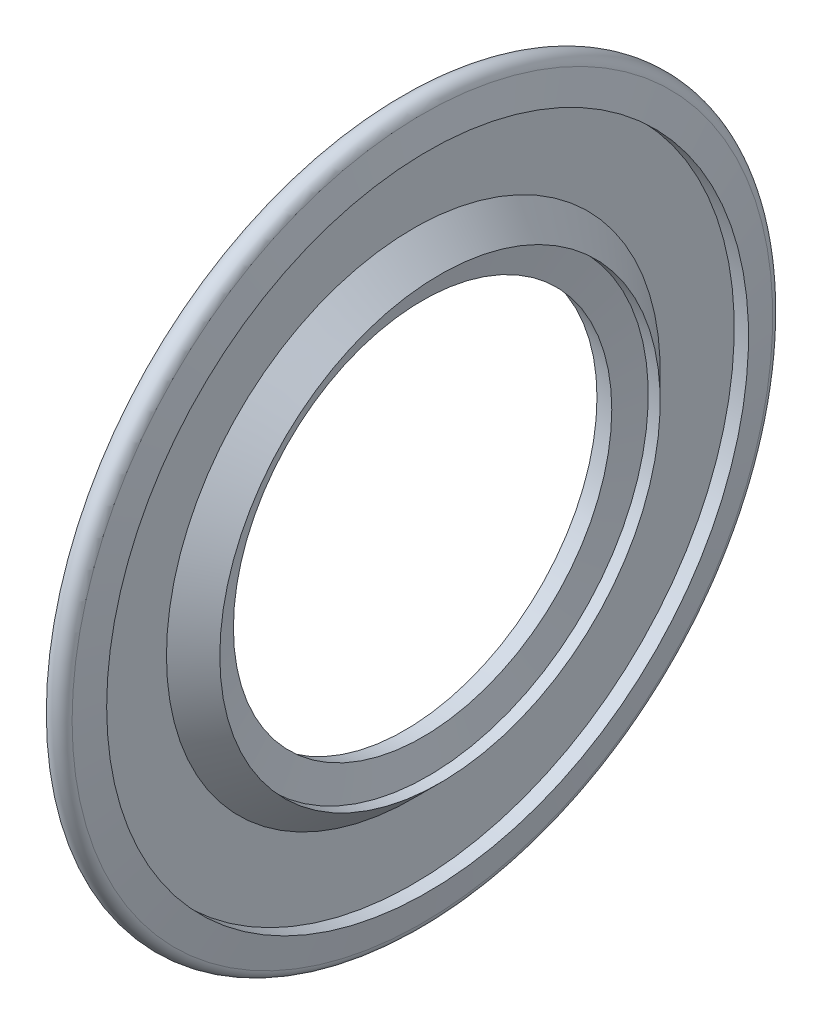
ISO-10303-21;
HEADER;
FILE_DESCRIPTION(('STEP AP214'),'2;1');
FILE_NAME('part.step','',(''),(''),'','','');
FILE_SCHEMA(('AUTOMOTIVE_DESIGN { 1 0 10303 214 1 1 1 1 }'));
ENDSEC;
DATA;
#1=APPLICATION_CONTEXT('core data for automotive mechanical design processes');
#2=APPLICATION_PROTOCOL_DEFINITION('international standard','automotive_design',2000,#1);
#3=PRODUCT_CONTEXT('',#1,'mechanical');
#4=PRODUCT('Part','Part','',(#3));
#5=PRODUCT_RELATED_PRODUCT_CATEGORY('part','',(#4));
#6=PRODUCT_DEFINITION_FORMATION('','',#4);
#7=PRODUCT_DEFINITION_CONTEXT('part definition',#1,'design');
#8=PRODUCT_DEFINITION('design','',#6,#7);
#9=PRODUCT_DEFINITION_SHAPE('','',#8);
#10=(LENGTH_UNIT() NAMED_UNIT(*) SI_UNIT(.MILLI.,.METRE.));
#11=(NAMED_UNIT(*) PLANE_ANGLE_UNIT() SI_UNIT($,.RADIAN.));
#12=(NAMED_UNIT(*) SI_UNIT($,.STERADIAN.) SOLID_ANGLE_UNIT());
#13=UNCERTAINTY_MEASURE_WITH_UNIT(LENGTH_MEASURE(1.E-05),#10,'distance_accuracy_value','');
#14=(GEOMETRIC_REPRESENTATION_CONTEXT(3) GLOBAL_UNCERTAINTY_ASSIGNED_CONTEXT((#13)) GLOBAL_UNIT_ASSIGNED_CONTEXT((#10,
#11,#12)) REPRESENTATION_CONTEXT('',''));
#15=CARTESIAN_POINT('',(0.,0.,0.));
#16=DIRECTION('',(0.,0.,1.));
#17=DIRECTION('',(1.,0.,0.));
#18=AXIS2_PLACEMENT_3D('',#15,#16,#17);
#19=CARTESIAN_POINT('',(0.304,6.075,0.));
#20=DIRECTION('',(1.,0.,0.));
#21=DIRECTION('',(0.,0.,-1.));
#22=AXIS2_PLACEMENT_3D('',#19,#20,#21);
#23=PLANE('',#22);
#24=CARTESIAN_POINT('',(0.304,0.,0.));
#25=DIRECTION('',(-1.,0.,0.));
#26=DIRECTION('',(0.,0.,1.));
#27=AXIS2_PLACEMENT_3D('',#24,#25,#26);
#28=CIRCLE('',#27,5.30689076557798);
#29=CARTESIAN_POINT('',(0.304,0.,5.30689076557798));
#30=VERTEX_POINT('',#29);
#31=EDGE_CURVE('E10',#30,#30,#28,.T.);
#32=ORIENTED_EDGE('',*,*,#31,.F.);
#33=EDGE_LOOP('',(#32));
#34=FACE_BOUND('',#33,.T.);
#35=CARTESIAN_POINT('',(0.304,0.,0.));
#36=DIRECTION('',(-1.,0.,0.));
#37=DIRECTION('',(0.,0.,1.));
#38=AXIS2_PLACEMENT_3D('',#35,#36,#37);
#39=CIRCLE('',#38,6.075);
#40=CARTESIAN_POINT('',(0.304,0.,6.075));
#41=VERTEX_POINT('',#40);
#42=EDGE_CURVE('E76',#41,#41,#39,.T.);
#43=ORIENTED_EDGE('',*,*,#42,.T.);
#44=EDGE_LOOP('',(#43));
#45=FACE_BOUND('',#44,.T.);
#46=ADVANCED_FACE('F14',(#34,#45),#23,.F.);
#47=CARTESIAN_POINT('',(0.304,0.,0.));
#48=DIRECTION('',(-1.,0.,0.));
#49=DIRECTION('',(0.,0.,1.));
#50=AXIS2_PLACEMENT_3D('',#47,#48,#49);
#51=CONICAL_SURFACE('',#50,5.30689076557798,0.174532925199432);
#52=CARTESIAN_POINT('',(0.8,0.,0.));
#53=DIRECTION('',(-1.,0.,0.));
#54=DIRECTION('',(0.,0.,1.));
#55=AXIS2_PLACEMENT_3D('',#52,#53,#54);
#56=CIRCLE('',#55,5.21943258314658);
#57=CARTESIAN_POINT('',(0.8,0.,5.21943258314658));
#58=VERTEX_POINT('',#57);
#59=EDGE_CURVE('E21',#58,#58,#56,.T.);
#60=ORIENTED_EDGE('',*,*,#59,.F.);
#61=EDGE_LOOP('',(#60));
#62=FACE_BOUND('',#61,.T.);
#63=ORIENTED_EDGE('',*,*,#31,.T.);
#64=EDGE_LOOP('',(#63));
#65=FACE_BOUND('',#64,.T.);
#66=ADVANCED_FACE('F144',(#62,#65),#51,.F.);
#67=CARTESIAN_POINT('',(0.8,0.,0.));
#68=DIRECTION('',(1.,0.,0.));
#69=DIRECTION('',(0.,0.,-1.));
#70=AXIS2_PLACEMENT_3D('',#67,#68,#69);
#71=CONICAL_SURFACE('',#70,5.21943258314658,1.39626340159546);
#72=CARTESIAN_POINT('',(0.950859619406303,0.,0.));
#73=DIRECTION('',(-1.,0.,0.));
#74=DIRECTION('',(0.,0.,1.));
#75=AXIS2_PLACEMENT_3D('',#72,#73,#74);
#76=CIRCLE('',#75,6.075);
#77=CARTESIAN_POINT('',(0.950859619406303,0.,6.075));
#78=VERTEX_POINT('',#77);
#79=EDGE_CURVE('E30',#78,#78,#76,.T.);
#80=ORIENTED_EDGE('',*,*,#79,.F.);
#81=EDGE_LOOP('',(#80));
#82=FACE_BOUND('',#81,.T.);
#83=ORIENTED_EDGE('',*,*,#59,.T.);
#84=EDGE_LOOP('',(#83));
#85=FACE_BOUND('',#84,.T.);
#86=ADVANCED_FACE('F139',(#82,#85),#71,.F.);
#87=CARTESIAN_POINT('',(0.16,0.,0.));
#88=DIRECTION('',(-1.,0.,0.));
#89=DIRECTION('',(0.,0.,1.));
#90=AXIS2_PLACEMENT_3D('',#87,#88,#89);
#91=CYLINDRICAL_SURFACE('',#90,6.075);
#92=CARTESIAN_POINT('',(1.28,0.,0.));
#93=DIRECTION('',(-1.,0.,0.));
#94=DIRECTION('',(0.,0.,1.));
#95=AXIS2_PLACEMENT_3D('',#92,#93,#94);
#96=CIRCLE('',#95,6.075);
#97=CARTESIAN_POINT('',(1.28,0.,6.075));
#98=VERTEX_POINT('',#97);
#99=EDGE_CURVE('E38',#98,#98,#96,.T.);
#100=ORIENTED_EDGE('',*,*,#99,.F.);
#101=EDGE_LOOP('',(#100));
#102=FACE_BOUND('',#101,.T.);
#103=ORIENTED_EDGE('',*,*,#79,.T.);
#104=EDGE_LOOP('',(#103));
#105=FACE_BOUND('',#104,.T.);
#106=ADVANCED_FACE('F133',(#102,#105),#91,.F.);
#107=CARTESIAN_POINT('',(1.28,0.,0.));
#108=DIRECTION('',(-1.,0.,0.));
#109=DIRECTION('',(0.,0.,1.));
#110=AXIS2_PLACEMENT_3D('',#107,#108,#109);
#111=CONICAL_SURFACE('',#110,6.075,0.785398163397449);
#112=CARTESIAN_POINT('',(0.544,0.,0.));
#113=DIRECTION('',(-1.,0.,0.));
#114=DIRECTION('',(0.,0.,1.));
#115=AXIS2_PLACEMENT_3D('',#112,#113,#114);
#116=CIRCLE('',#115,6.811);
#117=CARTESIAN_POINT('',(0.544,0.,6.811));
#118=VERTEX_POINT('',#117);
#119=EDGE_CURVE('E44',#118,#118,#116,.T.);
#120=ORIENTED_EDGE('',*,*,#119,.F.);
#121=EDGE_LOOP('',(#120));
#122=FACE_BOUND('',#121,.T.);
#123=ORIENTED_EDGE('',*,*,#99,.T.);
#124=EDGE_LOOP('',(#123));
#125=FACE_BOUND('',#124,.T.);
#126=ADVANCED_FACE('F127',(#122,#125),#111,.T.);
#127=CARTESIAN_POINT('',(0.544,6.811,0.));
#128=DIRECTION('',(-1.,0.,0.));
#129=DIRECTION('',(0.,0.,1.));
#130=AXIS2_PLACEMENT_3D('',#127,#128,#129);
#131=PLANE('',#130);
#132=CARTESIAN_POINT('',(0.544,0.,0.));
#133=DIRECTION('',(-1.,0.,0.));
#134=DIRECTION('',(0.,0.,1.));
#135=AXIS2_PLACEMENT_3D('',#132,#133,#134);
#136=CIRCLE('',#135,8.8545);
#137=CARTESIAN_POINT('',(0.544,0.,8.8545));
#138=VERTEX_POINT('',#137);
#139=EDGE_CURVE('E48',#138,#138,#136,.T.);
#140=ORIENTED_EDGE('',*,*,#139,.F.);
#141=EDGE_LOOP('',(#140));
#142=FACE_BOUND('',#141,.T.);
#143=ORIENTED_EDGE('',*,*,#119,.T.);
#144=EDGE_LOOP('',(#143));
#145=FACE_BOUND('',#144,.T.);
#146=ADVANCED_FACE('F121',(#142,#145),#131,.F.);
#147=CARTESIAN_POINT('',(0.16,0.,0.));
#148=DIRECTION('',(-1.,0.,0.));
#149=DIRECTION('',(0.,0.,1.));
#150=AXIS2_PLACEMENT_3D('',#147,#148,#149);
#151=CYLINDRICAL_SURFACE('',#150,8.8545);
#152=CARTESIAN_POINT('',(0.938081018936399,0.,0.));
#153=DIRECTION('',(-1.,0.,0.));
#154=DIRECTION('',(0.,0.,1.));
#155=AXIS2_PLACEMENT_3D('',#152,#153,#154);
#156=CIRCLE('',#155,8.8545);
#157=CARTESIAN_POINT('',(0.938081018936399,0.,8.8545));
#158=VERTEX_POINT('',#157);
#159=EDGE_CURVE('E52',#158,#158,#156,.T.);
#160=ORIENTED_EDGE('',*,*,#159,.F.);
#161=EDGE_LOOP('',(#160));
#162=FACE_BOUND('',#161,.T.);
#163=ORIENTED_EDGE('',*,*,#139,.T.);
#164=EDGE_LOOP('',(#163));
#165=FACE_BOUND('',#164,.T.);
#166=ADVANCED_FACE('F115',(#162,#165),#151,.F.);
#167=CARTESIAN_POINT('',(0.938081018936399,0.,0.));
#168=DIRECTION('',(-1.,0.,0.));
#169=DIRECTION('',(0.,0.,1.));
#170=AXIS2_PLACEMENT_3D('',#167,#168,#169);
#171=CONICAL_SURFACE('',#170,8.8545,1.39626340159546);
#172=CARTESIAN_POINT('',(0.795138480963906,0.,0.));
#173=DIRECTION('',(-1.,0.,0.));
#174=DIRECTION('',(0.,0.,1.));
#175=AXIS2_PLACEMENT_3D('',#172,#173,#174);
#176=CIRCLE('',#175,9.66516741685342);
#177=CARTESIAN_POINT('',(0.795138480963906,0.,9.66516741685342));
#178=VERTEX_POINT('',#177);
#179=EDGE_CURVE('E56',#178,#178,#176,.T.);
#180=ORIENTED_EDGE('',*,*,#179,.F.);
#181=EDGE_LOOP('',(#180));
#182=FACE_BOUND('',#181,.T.);
#183=ORIENTED_EDGE('',*,*,#159,.T.);
#184=EDGE_LOOP('',(#183));
#185=FACE_BOUND('',#184,.T.);
#186=ADVANCED_FACE('F109',(#182,#185),#171,.T.);
#187=CARTESIAN_POINT('',(0.48,0.,0.));
#188=DIRECTION('',(-1.,0.,0.));
#189=DIRECTION('',(0.,0.,1.));
#190=AXIS2_PLACEMENT_3D('',#187,#188,#189);
#191=TOROIDAL_SURFACE('',#190,9.6096,0.32);
#192=CARTESIAN_POINT('',(0.20287187078898,0.,0.));
#193=DIRECTION('',(-1.,0.,0.));
#194=DIRECTION('',(0.,0.,1.));
#195=AXIS2_PLACEMENT_3D('',#192,#193,#194);
#196=CIRCLE('',#195,9.7696);
#197=CARTESIAN_POINT('',(0.20287187078898,0.,9.7696));
#198=VERTEX_POINT('',#197);
#199=EDGE_CURVE('E60',#198,#198,#196,.T.);
#200=ORIENTED_EDGE('',*,*,#199,.F.);
#201=EDGE_LOOP('',(#200));
#202=FACE_BOUND('',#201,.T.);
#203=ORIENTED_EDGE('',*,*,#179,.T.);
#204=EDGE_LOOP('',(#203));
#205=FACE_BOUND('',#204,.T.);
#206=ADVANCED_FACE('F103',(#202,#205),#191,.T.);
#207=CARTESIAN_POINT('',(0.20287187078898,9.7696,0.));
#208=DIRECTION('',(1.,0.,0.));
#209=DIRECTION('',(0.,0.,-1.));
#210=AXIS2_PLACEMENT_3D('',#207,#208,#209);
#211=PLANE('',#210);
#212=CARTESIAN_POINT('',(0.20287187078898,0.,0.));
#213=DIRECTION('',(-1.,0.,0.));
#214=DIRECTION('',(0.,0.,1.));
#215=AXIS2_PLACEMENT_3D('',#212,#213,#214);
#216=CIRCLE('',#215,9.2576);
#217=CARTESIAN_POINT('',(0.20287187078898,0.,9.2576));
#218=VERTEX_POINT('',#217);
#219=EDGE_CURVE('E64',#218,#218,#216,.T.);
#220=ORIENTED_EDGE('',*,*,#219,.F.);
#221=EDGE_LOOP('',(#220));
#222=FACE_BOUND('',#221,.T.);
#223=ORIENTED_EDGE('',*,*,#199,.T.);
#224=EDGE_LOOP('',(#223));
#225=FACE_BOUND('',#224,.T.);
#226=ADVANCED_FACE('F97',(#222,#225),#211,.F.);
#227=CARTESIAN_POINT('',(0.20287187078898,0.,0.));
#228=DIRECTION('',(1.,0.,0.));
#229=DIRECTION('',(0.,0.,-1.));
#230=AXIS2_PLACEMENT_3D('',#227,#228,#229);
#231=CONICAL_SURFACE('',#230,9.2576,0.785398163397452);
#232=CARTESIAN_POINT('',(0.064,0.,0.));
#233=DIRECTION('',(-1.,0.,0.));
#234=DIRECTION('',(0.,0.,1.));
#235=AXIS2_PLACEMENT_3D('',#232,#233,#234);
#236=CIRCLE('',#235,9.11872812921102);
#237=CARTESIAN_POINT('',(0.064,0.,9.11872812921102));
#238=VERTEX_POINT('',#237);
#239=EDGE_CURVE('E68',#238,#238,#236,.T.);
#240=ORIENTED_EDGE('',*,*,#239,.F.);
#241=EDGE_LOOP('',(#240));
#242=FACE_BOUND('',#241,.T.);
#243=ORIENTED_EDGE('',*,*,#219,.T.);
#244=EDGE_LOOP('',(#243));
#245=FACE_BOUND('',#244,.T.);
#246=ADVANCED_FACE('F91',(#242,#245),#231,.T.);
#247=CARTESIAN_POINT('',(0.064,9.11872812921102,0.));
#248=DIRECTION('',(1.,0.,0.));
#249=DIRECTION('',(0.,0.,-1.));
#250=AXIS2_PLACEMENT_3D('',#247,#248,#249);
#251=PLANE('',#250);
#252=CARTESIAN_POINT('',(0.064,0.,0.));
#253=DIRECTION('',(-1.,0.,0.));
#254=DIRECTION('',(0.,0.,1.));
#255=AXIS2_PLACEMENT_3D('',#252,#253,#254);
#256=CIRCLE('',#255,6.075);
#257=CARTESIAN_POINT('',(0.064,0.,6.075));
#258=VERTEX_POINT('',#257);
#259=EDGE_CURVE('E72',#258,#258,#256,.T.);
#260=ORIENTED_EDGE('',*,*,#259,.F.);
#261=EDGE_LOOP('',(#260));
#262=FACE_BOUND('',#261,.T.);
#263=ORIENTED_EDGE('',*,*,#239,.T.);
#264=EDGE_LOOP('',(#263));
#265=FACE_BOUND('',#264,.T.);
#266=ADVANCED_FACE('F85',(#262,#265),#251,.F.);
#267=CARTESIAN_POINT('',(0.16,0.,0.));
#268=DIRECTION('',(-1.,0.,0.));
#269=DIRECTION('',(0.,0.,1.));
#270=AXIS2_PLACEMENT_3D('',#267,#268,#269);
#271=CYLINDRICAL_SURFACE('',#270,6.075);
#272=ORIENTED_EDGE('',*,*,#42,.F.);
#273=EDGE_LOOP('',(#272));
#274=FACE_BOUND('',#273,.T.);
#275=ORIENTED_EDGE('',*,*,#259,.T.);
#276=EDGE_LOOP('',(#275));
#277=FACE_BOUND('',#276,.T.);
#278=ADVANCED_FACE('F82',(#274,#277),#271,.F.);
#279=CLOSED_SHELL('',(#46,#66,#86,#106,#126,#146,#166,#186,#206,#226,#246,#266,#278));
#280=MANIFOLD_SOLID_BREP('B1',#279);
#281=ADVANCED_BREP_SHAPE_REPRESENTATION('',(#18,#280),#14);
#282=SHAPE_DEFINITION_REPRESENTATION(#9,#281);
ENDSEC;
END-ISO-10303-21;
